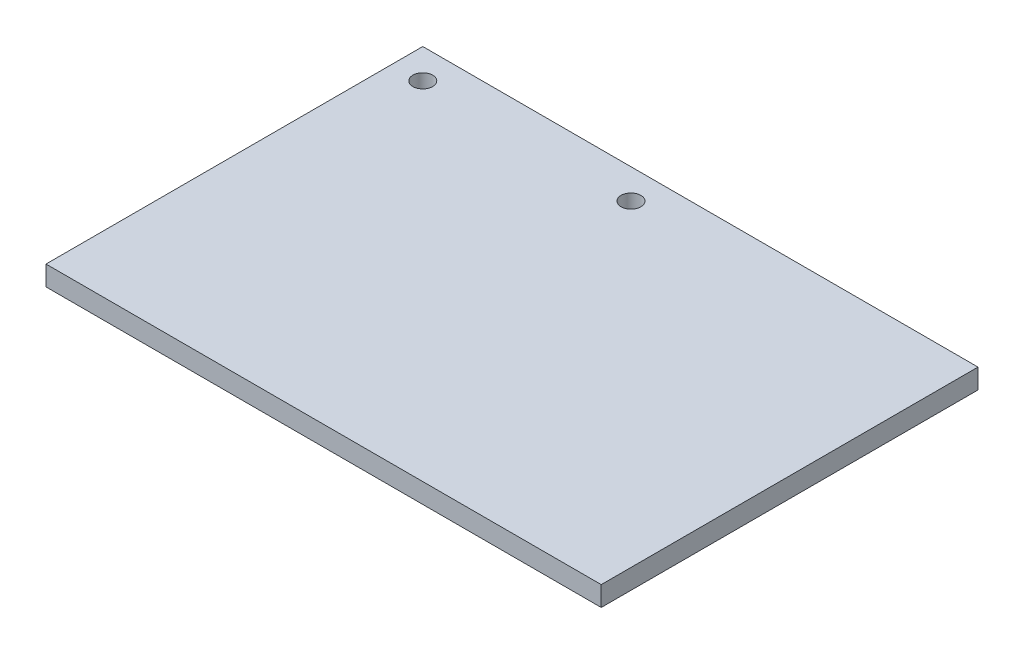
ISO-10303-21;
HEADER;
FILE_DESCRIPTION(('STEP AP214'),'2;1');
FILE_NAME('part.step','',(''),(''),'','','');
FILE_SCHEMA(('AUTOMOTIVE_DESIGN { 1 0 10303 214 1 1 1 1 }'));
ENDSEC;
DATA;
#1=APPLICATION_CONTEXT('core data for automotive mechanical design processes');
#2=APPLICATION_PROTOCOL_DEFINITION('international standard','automotive_design',2000,#1);
#3=PRODUCT_CONTEXT('',#1,'mechanical');
#4=PRODUCT('Part','Part','',(#3));
#5=PRODUCT_RELATED_PRODUCT_CATEGORY('part','',(#4));
#6=PRODUCT_DEFINITION_FORMATION('','',#4);
#7=PRODUCT_DEFINITION_CONTEXT('part definition',#1,'design');
#8=PRODUCT_DEFINITION('design','',#6,#7);
#9=PRODUCT_DEFINITION_SHAPE('','',#8);
#10=(LENGTH_UNIT() NAMED_UNIT(*) SI_UNIT(.MILLI.,.METRE.));
#11=(NAMED_UNIT(*) PLANE_ANGLE_UNIT() SI_UNIT($,.RADIAN.));
#12=(NAMED_UNIT(*) SI_UNIT($,.STERADIAN.) SOLID_ANGLE_UNIT());
#13=UNCERTAINTY_MEASURE_WITH_UNIT(LENGTH_MEASURE(1.E-05),#10,'distance_accuracy_value','');
#14=(GEOMETRIC_REPRESENTATION_CONTEXT(3) GLOBAL_UNCERTAINTY_ASSIGNED_CONTEXT((#13)) GLOBAL_UNIT_ASSIGNED_CONTEXT((#10,
#11,#12)) REPRESENTATION_CONTEXT('',''));
#15=CARTESIAN_POINT('',(0.,0.,0.));
#16=DIRECTION('',(0.,0.,1.));
#17=DIRECTION('',(1.,0.,0.));
#18=AXIS2_PLACEMENT_3D('',#15,#16,#17);
#19=CARTESIAN_POINT('',(140.,10.,95.));
#20=DIRECTION('',(-1.,0.,0.));
#21=DIRECTION('',(0.,0.,1.));
#22=AXIS2_PLACEMENT_3D('',#19,#20,#21);
#23=PLANE('',#22);
#24=DIRECTION('',(0.,0.,-1.));
#25=VECTOR('',#24,1.);
#26=CARTESIAN_POINT('',(140.,0.,95.));
#27=LINE('',#26,#25);
#28=CARTESIAN_POINT('',(140.,0.,95.));
#29=VERTEX_POINT('',#28);
#30=CARTESIAN_POINT('',(140.,0.,-95.));
#31=VERTEX_POINT('',#30);
#32=EDGE_CURVE('E96',#29,#31,#27,.T.);
#33=ORIENTED_EDGE('',*,*,#32,.T.);
#34=DIRECTION('',(0.,-1.,0.));
#35=VECTOR('',#34,1.);
#36=CARTESIAN_POINT('',(140.,10.,-95.));
#37=LINE('',#36,#35);
#38=CARTESIAN_POINT('',(140.,10.,-95.));
#39=VERTEX_POINT('',#38);
#40=EDGE_CURVE('E11',#39,#31,#37,.T.);
#41=ORIENTED_EDGE('',*,*,#40,.F.);
#42=DIRECTION('',(0.,0.,-1.));
#43=VECTOR('',#42,1.);
#44=CARTESIAN_POINT('',(140.,10.,95.));
#45=LINE('',#44,#43);
#46=CARTESIAN_POINT('',(140.,10.,95.));
#47=VERTEX_POINT('',#46);
#48=EDGE_CURVE('E84',#47,#39,#45,.T.);
#49=ORIENTED_EDGE('',*,*,#48,.F.);
#50=DIRECTION('',(0.,-1.,0.));
#51=VECTOR('',#50,1.);
#52=CARTESIAN_POINT('',(140.,10.,95.));
#53=LINE('',#52,#51);
#54=EDGE_CURVE('E92',#47,#29,#53,.T.);
#55=ORIENTED_EDGE('',*,*,#54,.T.);
#56=EDGE_LOOP('',(#33,#41,#49,#55));
#57=FACE_BOUND('',#56,.T.);
#58=ADVANCED_FACE('F33',(#57),#23,.F.);
#59=CARTESIAN_POINT('',(-140.,10.,-95.));
#60=DIRECTION('',(0.,0.,1.));
#61=DIRECTION('',(1.,0.,0.));
#62=AXIS2_PLACEMENT_3D('',#59,#60,#61);
#63=PLANE('',#62);
#64=DIRECTION('',(-1.,0.,0.));
#65=VECTOR('',#64,1.);
#66=CARTESIAN_POINT('',(-140.,0.,-95.));
#67=LINE('',#66,#65);
#68=CARTESIAN_POINT('',(-140.,0.,-95.));
#69=VERTEX_POINT('',#68);
#70=EDGE_CURVE('E88',#31,#69,#67,.T.);
#71=ORIENTED_EDGE('',*,*,#70,.T.);
#72=DIRECTION('',(0.,-1.,0.));
#73=VECTOR('',#72,1.);
#74=CARTESIAN_POINT('',(-140.,10.,-95.));
#75=LINE('',#74,#73);
#76=CARTESIAN_POINT('',(-140.,10.,-95.));
#77=VERTEX_POINT('',#76);
#78=EDGE_CURVE('E41',#77,#69,#75,.T.);
#79=ORIENTED_EDGE('',*,*,#78,.F.);
#80=DIRECTION('',(-1.,0.,0.));
#81=VECTOR('',#80,1.);
#82=CARTESIAN_POINT('',(-140.,10.,-95.));
#83=LINE('',#82,#81);
#84=EDGE_CURVE('E79',#39,#77,#83,.T.);
#85=ORIENTED_EDGE('',*,*,#84,.F.);
#86=ORIENTED_EDGE('',*,*,#40,.T.);
#87=EDGE_LOOP('',(#71,#79,#85,#86));
#88=FACE_BOUND('',#87,.T.);
#89=ADVANCED_FACE('F87',(#88),#63,.F.);
#90=CARTESIAN_POINT('',(-140.,10.,95.));
#91=DIRECTION('',(1.,0.,0.));
#92=DIRECTION('',(0.,0.,-1.));
#93=AXIS2_PLACEMENT_3D('',#90,#91,#92);
#94=PLANE('',#93);
#95=DIRECTION('',(0.,0.,1.));
#96=VECTOR('',#95,1.);
#97=CARTESIAN_POINT('',(-140.,0.,95.));
#98=LINE('',#97,#96);
#99=CARTESIAN_POINT('',(-140.,0.,95.));
#100=VERTEX_POINT('',#99);
#101=EDGE_CURVE('E66',#69,#100,#98,.T.);
#102=ORIENTED_EDGE('',*,*,#101,.T.);
#103=DIRECTION('',(0.,-1.,0.));
#104=VECTOR('',#103,1.);
#105=CARTESIAN_POINT('',(-140.,10.,95.));
#106=LINE('',#105,#104);
#107=CARTESIAN_POINT('',(-140.,10.,95.));
#108=VERTEX_POINT('',#107);
#109=EDGE_CURVE('E89',#108,#100,#106,.T.);
#110=ORIENTED_EDGE('',*,*,#109,.F.);
#111=DIRECTION('',(0.,0.,1.));
#112=VECTOR('',#111,1.);
#113=CARTESIAN_POINT('',(-140.,10.,95.));
#114=LINE('',#113,#112);
#115=EDGE_CURVE('E82',#77,#108,#114,.T.);
#116=ORIENTED_EDGE('',*,*,#115,.F.);
#117=ORIENTED_EDGE('',*,*,#78,.T.);
#118=EDGE_LOOP('',(#102,#110,#116,#117));
#119=FACE_BOUND('',#118,.T.);
#120=ADVANCED_FACE('F90',(#119),#94,.F.);
#121=CARTESIAN_POINT('',(-140.,10.,95.));
#122=DIRECTION('',(0.,0.,-1.));
#123=DIRECTION('',(-1.,0.,0.));
#124=AXIS2_PLACEMENT_3D('',#121,#122,#123);
#125=PLANE('',#124);
#126=DIRECTION('',(1.,0.,0.));
#127=VECTOR('',#126,1.);
#128=CARTESIAN_POINT('',(-140.,0.,95.));
#129=LINE('',#128,#127);
#130=EDGE_CURVE('E72',#100,#29,#129,.T.);
#131=ORIENTED_EDGE('',*,*,#130,.T.);
#132=ORIENTED_EDGE('',*,*,#54,.F.);
#133=DIRECTION('',(1.,0.,0.));
#134=VECTOR('',#133,1.);
#135=CARTESIAN_POINT('',(-140.,10.,95.));
#136=LINE('',#135,#134);
#137=EDGE_CURVE('E49',#108,#47,#136,.T.);
#138=ORIENTED_EDGE('',*,*,#137,.F.);
#139=ORIENTED_EDGE('',*,*,#109,.T.);
#140=EDGE_LOOP('',(#131,#132,#138,#139));
#141=FACE_BOUND('',#140,.T.);
#142=ADVANCED_FACE('F104',(#141),#125,.F.);
#143=CARTESIAN_POINT('',(0.,10.,0.));
#144=DIRECTION('',(0.,-1.,0.));
#145=DIRECTION('',(0.,0.,-1.));
#146=AXIS2_PLACEMENT_3D('',#143,#144,#145);
#147=PLANE('',#146);
#148=CARTESIAN_POINT('',(-20.0000000000001,10.,-80.));
#149=DIRECTION('',(0.,1.,0.));
#150=DIRECTION('',(0.,0.,1.));
#151=AXIS2_PLACEMENT_3D('',#148,#149,#150);
#152=CIRCLE('',#151,5.00000000000001);
#153=CARTESIAN_POINT('',(-20.0000000000001,10.,-75.));
#154=VERTEX_POINT('',#153);
#155=EDGE_CURVE('E118',#154,#154,#152,.T.);
#156=ORIENTED_EDGE('',*,*,#155,.F.);
#157=EDGE_LOOP('',(#156));
#158=FACE_BOUND('',#157,.T.);
#159=CARTESIAN_POINT('',(-125.,10.,-80.));
#160=DIRECTION('',(0.,1.,0.));
#161=DIRECTION('',(0.,0.,1.));
#162=AXIS2_PLACEMENT_3D('',#159,#160,#161);
#163=CIRCLE('',#162,5.00000000000001);
#164=CARTESIAN_POINT('',(-125.,10.,-75.));
#165=VERTEX_POINT('',#164);
#166=EDGE_CURVE('E112',#165,#165,#163,.T.);
#167=ORIENTED_EDGE('',*,*,#166,.F.);
#168=EDGE_LOOP('',(#167));
#169=FACE_BOUND('',#168,.T.);
#170=ORIENTED_EDGE('',*,*,#48,.T.);
#171=ORIENTED_EDGE('',*,*,#84,.T.);
#172=ORIENTED_EDGE('',*,*,#115,.T.);
#173=ORIENTED_EDGE('',*,*,#137,.T.);
#174=EDGE_LOOP('',(#170,#171,#172,#173));
#175=FACE_BOUND('',#174,.T.);
#176=ADVANCED_FACE('F80',(#158,#169,#175),#147,.F.);
#177=CARTESIAN_POINT('',(0.,0.,0.));
#178=DIRECTION('',(0.,-1.,0.));
#179=DIRECTION('',(0.,0.,-1.));
#180=AXIS2_PLACEMENT_3D('',#177,#178,#179);
#181=PLANE('',#180);
#182=CARTESIAN_POINT('',(-20.0000000000001,0.,-80.));
#183=DIRECTION('',(0.,-1.,0.));
#184=DIRECTION('',(0.,0.,-1.));
#185=AXIS2_PLACEMENT_3D('',#182,#183,#184);
#186=CIRCLE('',#185,5.00000000000001);
#187=CARTESIAN_POINT('',(-20.0000000000001,0.,-85.));
#188=VERTEX_POINT('',#187);
#189=EDGE_CURVE('E115',#188,#188,#186,.F.);
#190=ORIENTED_EDGE('',*,*,#189,.T.);
#191=EDGE_LOOP('',(#190));
#192=FACE_BOUND('',#191,.T.);
#193=CARTESIAN_POINT('',(-125.,0.,-80.));
#194=DIRECTION('',(0.,-1.,0.));
#195=DIRECTION('',(0.,0.,-1.));
#196=AXIS2_PLACEMENT_3D('',#193,#194,#195);
#197=CIRCLE('',#196,5.00000000000001);
#198=CARTESIAN_POINT('',(-125.,0.,-85.));
#199=VERTEX_POINT('',#198);
#200=EDGE_CURVE('E99',#199,#199,#197,.F.);
#201=ORIENTED_EDGE('',*,*,#200,.T.);
#202=EDGE_LOOP('',(#201));
#203=FACE_BOUND('',#202,.T.);
#204=ORIENTED_EDGE('',*,*,#32,.F.);
#205=ORIENTED_EDGE('',*,*,#130,.F.);
#206=ORIENTED_EDGE('',*,*,#101,.F.);
#207=ORIENTED_EDGE('',*,*,#70,.F.);
#208=EDGE_LOOP('',(#204,#205,#206,#207));
#209=FACE_BOUND('',#208,.T.);
#210=ADVANCED_FACE('F107',(#192,#203,#209),#181,.T.);
#211=CARTESIAN_POINT('',(-125.,-14.142135623731,-80.));
#212=DIRECTION('',(0.,1.,0.));
#213=DIRECTION('',(0.,0.,1.));
#214=AXIS2_PLACEMENT_3D('',#211,#212,#213);
#215=CYLINDRICAL_SURFACE('',#214,5.00000000000001);
#216=ORIENTED_EDGE('',*,*,#166,.T.);
#217=EDGE_LOOP('',(#216));
#218=FACE_BOUND('',#217,.T.);
#219=ORIENTED_EDGE('',*,*,#200,.F.);
#220=EDGE_LOOP('',(#219));
#221=FACE_BOUND('',#220,.T.);
#222=ADVANCED_FACE('F130',(#218,#221),#215,.F.);
#223=CARTESIAN_POINT('',(-20.0000000000001,-14.142135623731,-80.));
#224=DIRECTION('',(0.,1.,0.));
#225=DIRECTION('',(0.,0.,1.));
#226=AXIS2_PLACEMENT_3D('',#223,#224,#225);
#227=CYLINDRICAL_SURFACE('',#226,5.00000000000001);
#228=ORIENTED_EDGE('',*,*,#155,.T.);
#229=EDGE_LOOP('',(#228));
#230=FACE_BOUND('',#229,.T.);
#231=ORIENTED_EDGE('',*,*,#189,.F.);
#232=EDGE_LOOP('',(#231));
#233=FACE_BOUND('',#232,.T.);
#234=ADVANCED_FACE('F122',(#230,#233),#227,.F.);
#235=CLOSED_SHELL('',(#58,#89,#120,#142,#176,#210,#222,#234));
#236=MANIFOLD_SOLID_BREP('B2',#235);
#237=ADVANCED_BREP_SHAPE_REPRESENTATION('',(#18,#236),#14);
#238=SHAPE_DEFINITION_REPRESENTATION(#9,#237);
ENDSEC;
END-ISO-10303-21;
